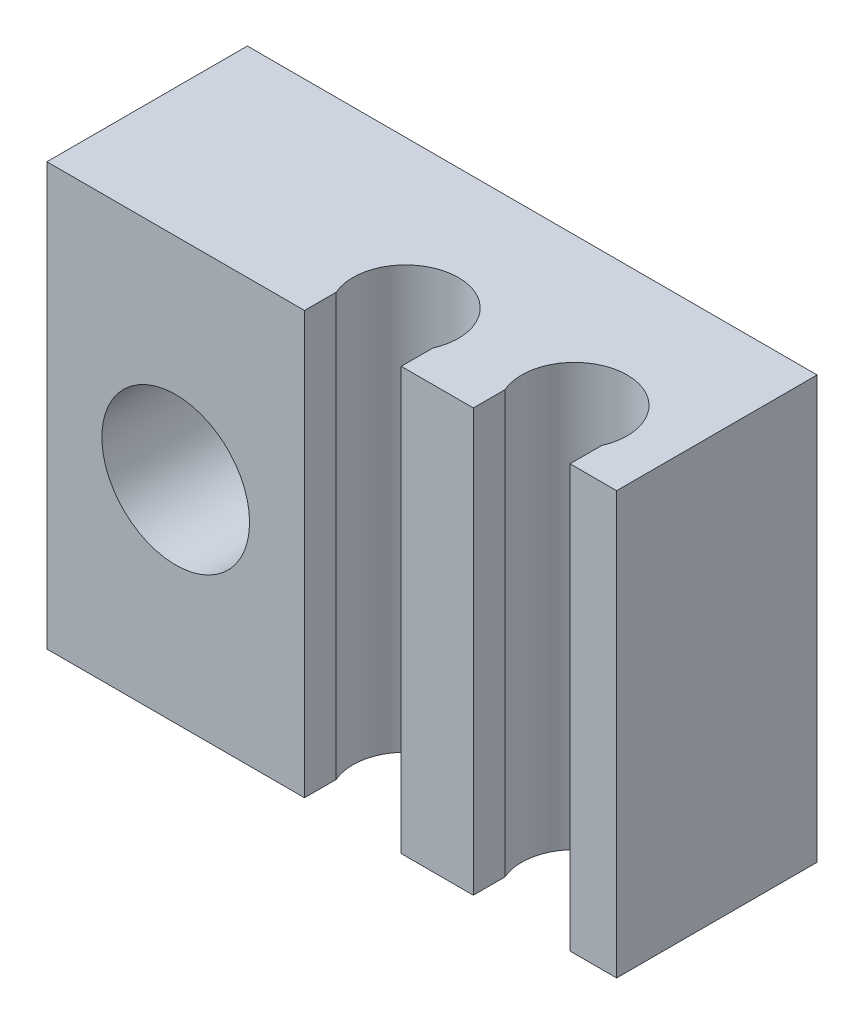
ISO-10303-21;
HEADER;
FILE_DESCRIPTION(('STEP AP214'),'2;1');
FILE_NAME('part.step','',(''),(''),'','','');
FILE_SCHEMA(('AUTOMOTIVE_DESIGN { 1 0 10303 214 1 1 1 1 }'));
ENDSEC;
DATA;
#1=APPLICATION_CONTEXT('core data for automotive mechanical design processes');
#2=APPLICATION_PROTOCOL_DEFINITION('international standard','automotive_design',2000,#1);
#3=PRODUCT_CONTEXT('',#1,'mechanical');
#4=PRODUCT('Part','Part','',(#3));
#5=PRODUCT_RELATED_PRODUCT_CATEGORY('part','',(#4));
#6=PRODUCT_DEFINITION_FORMATION('','',#4);
#7=PRODUCT_DEFINITION_CONTEXT('part definition',#1,'design');
#8=PRODUCT_DEFINITION('design','',#6,#7);
#9=PRODUCT_DEFINITION_SHAPE('','',#8);
#10=(LENGTH_UNIT() NAMED_UNIT(*) SI_UNIT(.MILLI.,.METRE.));
#11=(NAMED_UNIT(*) PLANE_ANGLE_UNIT() SI_UNIT($,.RADIAN.));
#12=(NAMED_UNIT(*) SI_UNIT($,.STERADIAN.) SOLID_ANGLE_UNIT());
#13=UNCERTAINTY_MEASURE_WITH_UNIT(LENGTH_MEASURE(1.E-05),#10,'distance_accuracy_value','');
#14=(GEOMETRIC_REPRESENTATION_CONTEXT(3) GLOBAL_UNCERTAINTY_ASSIGNED_CONTEXT((#13)) GLOBAL_UNIT_ASSIGNED_CONTEXT((#10,
#11,#12)) REPRESENTATION_CONTEXT('',''));
#15=CARTESIAN_POINT('',(0.,0.,0.));
#16=DIRECTION('',(0.,0.,1.));
#17=DIRECTION('',(1.,0.,0.));
#18=AXIS2_PLACEMENT_3D('',#15,#16,#17);
#19=CARTESIAN_POINT('',(1.10435607626104,10.,0.));
#20=DIRECTION('',(1.,0.,0.));
#21=DIRECTION('',(0.,0.,-1.));
#22=AXIS2_PLACEMENT_3D('',#19,#20,#21);
#23=PLANE('',#22);
#24=DIRECTION('',(0.,0.,1.));
#25=VECTOR('',#24,1.);
#26=CARTESIAN_POINT('',(1.10435607626104,0.,0.));
#27=LINE('',#26,#25);
#28=CARTESIAN_POINT('',(1.10435607626104,0.,0.));
#29=VERTEX_POINT('',#28);
#30=CARTESIAN_POINT('',(1.10435607626104,0.,0.750000000000001));
#31=VERTEX_POINT('',#30);
#32=EDGE_CURVE('E157',#29,#31,#27,.T.);
#33=ORIENTED_EDGE('',*,*,#32,.F.);
#34=DIRECTION('',(0.,-1.,0.));
#35=VECTOR('',#34,1.);
#36=CARTESIAN_POINT('',(1.10435607626104,10.,0.));
#37=LINE('',#36,#35);
#38=CARTESIAN_POINT('',(1.10435607626104,10.,0.));
#39=VERTEX_POINT('',#38);
#40=EDGE_CURVE('E11',#39,#29,#37,.T.);
#41=ORIENTED_EDGE('',*,*,#40,.F.);
#42=DIRECTION('',(0.,0.,1.));
#43=VECTOR('',#42,1.);
#44=CARTESIAN_POINT('',(1.10435607626104,10.,0.));
#45=LINE('',#44,#43);
#46=CARTESIAN_POINT('',(1.10435607626104,10.,0.750000000000001));
#47=VERTEX_POINT('',#46);
#48=EDGE_CURVE('E185',#39,#47,#45,.T.);
#49=ORIENTED_EDGE('',*,*,#48,.T.);
#50=DIRECTION('',(0.,-1.,0.));
#51=VECTOR('',#50,1.);
#52=CARTESIAN_POINT('',(1.10435607626104,10.,0.750000000000001));
#53=LINE('',#52,#51);
#54=EDGE_CURVE('E104',#47,#31,#53,.T.);
#55=ORIENTED_EDGE('',*,*,#54,.T.);
#56=EDGE_LOOP('',(#33,#41,#49,#55));
#57=FACE_BOUND('',#56,.T.);
#58=ADVANCED_FACE('F41',(#57),#23,.T.);
#59=CARTESIAN_POINT('',(2.25,10.,-0.5));
#60=DIRECTION('',(0.,-1.,0.));
#61=DIRECTION('',(0.,0.,-1.));
#62=AXIS2_PLACEMENT_3D('',#59,#60,#61);
#63=CYLINDRICAL_SURFACE('',#62,1.25);
#64=CARTESIAN_POINT('',(2.25,0.,-0.5));
#65=DIRECTION('',(0.,1.,0.));
#66=DIRECTION('',(0.,0.,1.));
#67=AXIS2_PLACEMENT_3D('',#64,#65,#66);
#68=CIRCLE('',#67,1.25);
#69=CARTESIAN_POINT('',(3.39564392373896,0.,0.));
#70=VERTEX_POINT('',#69);
#71=EDGE_CURVE('E160',#70,#29,#68,.T.);
#72=ORIENTED_EDGE('',*,*,#71,.F.);
#73=DIRECTION('',(0.,-1.,0.));
#74=VECTOR('',#73,1.);
#75=CARTESIAN_POINT('',(3.39564392373896,10.,0.));
#76=LINE('',#75,#74);
#77=CARTESIAN_POINT('',(3.39564392373896,10.,0.));
#78=VERTEX_POINT('',#77);
#79=EDGE_CURVE('E49',#78,#70,#76,.T.);
#80=ORIENTED_EDGE('',*,*,#79,.F.);
#81=CARTESIAN_POINT('',(2.25,10.,-0.5));
#82=DIRECTION('',(0.,1.,0.));
#83=DIRECTION('',(0.,0.,1.));
#84=AXIS2_PLACEMENT_3D('',#81,#82,#83);
#85=CIRCLE('',#84,1.25);
#86=EDGE_CURVE('E217',#78,#39,#85,.T.);
#87=ORIENTED_EDGE('',*,*,#86,.T.);
#88=ORIENTED_EDGE('',*,*,#40,.T.);
#89=EDGE_LOOP('',(#72,#80,#87,#88));
#90=FACE_BOUND('',#89,.T.);
#91=ADVANCED_FACE('F216',(#90),#63,.F.);
#92=CARTESIAN_POINT('',(3.39564392373896,10.,0.));
#93=DIRECTION('',(1.,0.,0.));
#94=DIRECTION('',(0.,0.,-1.));
#95=AXIS2_PLACEMENT_3D('',#92,#93,#94);
#96=PLANE('',#95);
#97=DIRECTION('',(0.,0.,1.));
#98=VECTOR('',#97,1.);
#99=CARTESIAN_POINT('',(3.39564392373896,0.,0.));
#100=LINE('',#99,#98);
#101=CARTESIAN_POINT('',(3.39564392373896,0.,0.750000000000001));
#102=VERTEX_POINT('',#101);
#103=EDGE_CURVE('E164',#70,#102,#100,.T.);
#104=ORIENTED_EDGE('',*,*,#103,.T.);
#105=DIRECTION('',(0.,-1.,0.));
#106=VECTOR('',#105,1.);
#107=CARTESIAN_POINT('',(3.39564392373896,10.,0.750000000000001));
#108=LINE('',#107,#106);
#109=CARTESIAN_POINT('',(3.39564392373896,10.,0.750000000000001));
#110=VERTEX_POINT('',#109);
#111=EDGE_CURVE('E201',#110,#102,#108,.T.);
#112=ORIENTED_EDGE('',*,*,#111,.F.);
#113=DIRECTION('',(0.,0.,1.));
#114=VECTOR('',#113,1.);
#115=CARTESIAN_POINT('',(3.39564392373896,10.,0.));
#116=LINE('',#115,#114);
#117=EDGE_CURVE('E208',#78,#110,#116,.T.);
#118=ORIENTED_EDGE('',*,*,#117,.F.);
#119=ORIENTED_EDGE('',*,*,#79,.T.);
#120=EDGE_LOOP('',(#104,#112,#118,#119));
#121=FACE_BOUND('',#120,.T.);
#122=ADVANCED_FACE('F206',(#121),#96,.F.);
#123=CARTESIAN_POINT('',(0.,10.,0.750000000000001));
#124=DIRECTION('',(0.,0.,-1.));
#125=DIRECTION('',(-1.,0.,0.));
#126=AXIS2_PLACEMENT_3D('',#123,#124,#125);
#127=PLANE('',#126);
#128=DIRECTION('',(1.,0.,0.));
#129=VECTOR('',#128,1.);
#130=CARTESIAN_POINT('',(0.,0.,0.750000000000001));
#131=LINE('',#130,#129);
#132=CARTESIAN_POINT('',(5.10435607626104,0.,0.750000000000001));
#133=VERTEX_POINT('',#132);
#134=EDGE_CURVE('E166',#102,#133,#131,.T.);
#135=ORIENTED_EDGE('',*,*,#134,.T.);
#136=DIRECTION('',(0.,-1.,0.));
#137=VECTOR('',#136,1.);
#138=CARTESIAN_POINT('',(5.10435607626104,10.,0.750000000000001));
#139=LINE('',#138,#137);
#140=CARTESIAN_POINT('',(5.10435607626104,10.,0.750000000000001));
#141=VERTEX_POINT('',#140);
#142=EDGE_CURVE('E199',#141,#133,#139,.T.);
#143=ORIENTED_EDGE('',*,*,#142,.F.);
#144=DIRECTION('',(1.,0.,0.));
#145=VECTOR('',#144,1.);
#146=CARTESIAN_POINT('',(0.,10.,0.750000000000001));
#147=LINE('',#146,#145);
#148=EDGE_CURVE('E228',#110,#141,#147,.T.);
#149=ORIENTED_EDGE('',*,*,#148,.F.);
#150=ORIENTED_EDGE('',*,*,#111,.T.);
#151=EDGE_LOOP('',(#135,#143,#149,#150));
#152=FACE_BOUND('',#151,.T.);
#153=ADVANCED_FACE('F262',(#152),#127,.F.);
#154=CARTESIAN_POINT('',(5.10435607626104,10.,0.));
#155=DIRECTION('',(1.,0.,0.));
#156=DIRECTION('',(0.,0.,-1.));
#157=AXIS2_PLACEMENT_3D('',#154,#155,#156);
#158=PLANE('',#157);
#159=DIRECTION('',(0.,0.,1.));
#160=VECTOR('',#159,1.);
#161=CARTESIAN_POINT('',(5.10435607626104,0.,0.));
#162=LINE('',#161,#160);
#163=CARTESIAN_POINT('',(5.10435607626104,0.,0.));
#164=VERTEX_POINT('',#163);
#165=EDGE_CURVE('E169',#164,#133,#162,.T.);
#166=ORIENTED_EDGE('',*,*,#165,.F.);
#167=DIRECTION('',(0.,-1.,0.));
#168=VECTOR('',#167,1.);
#169=CARTESIAN_POINT('',(5.10435607626104,10.,0.));
#170=LINE('',#169,#168);
#171=CARTESIAN_POINT('',(5.10435607626104,10.,0.));
#172=VERTEX_POINT('',#171);
#173=EDGE_CURVE('E197',#172,#164,#170,.T.);
#174=ORIENTED_EDGE('',*,*,#173,.F.);
#175=DIRECTION('',(0.,0.,1.));
#176=VECTOR('',#175,1.);
#177=CARTESIAN_POINT('',(5.10435607626104,10.,0.));
#178=LINE('',#177,#176);
#179=EDGE_CURVE('E230',#172,#141,#178,.T.);
#180=ORIENTED_EDGE('',*,*,#179,.T.);
#181=ORIENTED_EDGE('',*,*,#142,.T.);
#182=EDGE_LOOP('',(#166,#174,#180,#181));
#183=FACE_BOUND('',#182,.T.);
#184=ADVANCED_FACE('F258',(#183),#158,.T.);
#185=CARTESIAN_POINT('',(6.25,10.,-0.5));
#186=DIRECTION('',(0.,-1.,0.));
#187=DIRECTION('',(0.,0.,-1.));
#188=AXIS2_PLACEMENT_3D('',#185,#186,#187);
#189=CYLINDRICAL_SURFACE('',#188,1.25);
#190=CARTESIAN_POINT('',(6.25,0.,-0.5));
#191=DIRECTION('',(0.,1.,0.));
#192=DIRECTION('',(0.,0.,1.));
#193=AXIS2_PLACEMENT_3D('',#190,#191,#192);
#194=CIRCLE('',#193,1.25);
#195=CARTESIAN_POINT('',(7.39564392373896,0.,0.));
#196=VERTEX_POINT('',#195);
#197=EDGE_CURVE('E172',#196,#164,#194,.T.);
#198=ORIENTED_EDGE('',*,*,#197,.F.);
#199=DIRECTION('',(0.,-1.,0.));
#200=VECTOR('',#199,1.);
#201=CARTESIAN_POINT('',(7.39564392373896,10.,0.));
#202=LINE('',#201,#200);
#203=CARTESIAN_POINT('',(7.39564392373896,10.,0.));
#204=VERTEX_POINT('',#203);
#205=EDGE_CURVE('E195',#204,#196,#202,.T.);
#206=ORIENTED_EDGE('',*,*,#205,.F.);
#207=CARTESIAN_POINT('',(6.25,10.,-0.5));
#208=DIRECTION('',(0.,1.,0.));
#209=DIRECTION('',(0.,0.,1.));
#210=AXIS2_PLACEMENT_3D('',#207,#208,#209);
#211=CIRCLE('',#210,1.25);
#212=EDGE_CURVE('E233',#204,#172,#211,.T.);
#213=ORIENTED_EDGE('',*,*,#212,.T.);
#214=ORIENTED_EDGE('',*,*,#173,.T.);
#215=EDGE_LOOP('',(#198,#206,#213,#214));
#216=FACE_BOUND('',#215,.T.);
#217=ADVANCED_FACE('F254',(#216),#189,.F.);
#218=CARTESIAN_POINT('',(7.39564392373896,10.,0.));
#219=DIRECTION('',(1.,0.,0.));
#220=DIRECTION('',(0.,0.,-1.));
#221=AXIS2_PLACEMENT_3D('',#218,#219,#220);
#222=PLANE('',#221);
#223=DIRECTION('',(0.,0.,1.));
#224=VECTOR('',#223,1.);
#225=CARTESIAN_POINT('',(7.39564392373896,0.,0.));
#226=LINE('',#225,#224);
#227=CARTESIAN_POINT('',(7.39564392373896,0.,0.750000000000001));
#228=VERTEX_POINT('',#227);
#229=EDGE_CURVE('E175',#196,#228,#226,.T.);
#230=ORIENTED_EDGE('',*,*,#229,.T.);
#231=DIRECTION('',(0.,-1.,0.));
#232=VECTOR('',#231,1.);
#233=CARTESIAN_POINT('',(7.39564392373896,10.,0.750000000000001));
#234=LINE('',#233,#232);
#235=CARTESIAN_POINT('',(7.39564392373896,10.,0.750000000000001));
#236=VERTEX_POINT('',#235);
#237=EDGE_CURVE('E192',#236,#228,#234,.T.);
#238=ORIENTED_EDGE('',*,*,#237,.F.);
#239=DIRECTION('',(0.,0.,1.));
#240=VECTOR('',#239,1.);
#241=CARTESIAN_POINT('',(7.39564392373896,10.,0.));
#242=LINE('',#241,#240);
#243=EDGE_CURVE('E236',#204,#236,#242,.T.);
#244=ORIENTED_EDGE('',*,*,#243,.F.);
#245=ORIENTED_EDGE('',*,*,#205,.T.);
#246=EDGE_LOOP('',(#230,#238,#244,#245));
#247=FACE_BOUND('',#246,.T.);
#248=ADVANCED_FACE('F302',(#247),#222,.F.);
#249=CARTESIAN_POINT('',(0.,10.,0.750000000000001));
#250=DIRECTION('',(0.,0.,-1.));
#251=DIRECTION('',(-1.,0.,0.));
#252=AXIS2_PLACEMENT_3D('',#249,#250,#251);
#253=PLANE('',#252);
#254=DIRECTION('',(1.,0.,0.));
#255=VECTOR('',#254,1.);
#256=CARTESIAN_POINT('',(0.,0.,0.750000000000001));
#257=LINE('',#256,#255);
#258=CARTESIAN_POINT('',(8.5,0.,0.750000000000001));
#259=VERTEX_POINT('',#258);
#260=EDGE_CURVE('E177',#228,#259,#257,.T.);
#261=ORIENTED_EDGE('',*,*,#260,.T.);
#262=DIRECTION('',(0.,-1.,0.));
#263=VECTOR('',#262,1.);
#264=CARTESIAN_POINT('',(8.5,10.,0.750000000000001));
#265=LINE('',#264,#263);
#266=CARTESIAN_POINT('',(8.5,10.,0.750000000000001));
#267=VERTEX_POINT('',#266);
#268=EDGE_CURVE('E189',#267,#259,#265,.T.);
#269=ORIENTED_EDGE('',*,*,#268,.F.);
#270=DIRECTION('',(1.,0.,0.));
#271=VECTOR('',#270,1.);
#272=CARTESIAN_POINT('',(0.,10.,0.750000000000001));
#273=LINE('',#272,#271);
#274=EDGE_CURVE('E238',#236,#267,#273,.T.);
#275=ORIENTED_EDGE('',*,*,#274,.F.);
#276=ORIENTED_EDGE('',*,*,#237,.T.);
#277=EDGE_LOOP('',(#261,#269,#275,#276));
#278=FACE_BOUND('',#277,.T.);
#279=ADVANCED_FACE('F245',(#278),#253,.F.);
#280=CARTESIAN_POINT('',(8.5,10.,0.));
#281=DIRECTION('',(-1.,0.,0.));
#282=DIRECTION('',(0.,0.,1.));
#283=AXIS2_PLACEMENT_3D('',#280,#281,#282);
#284=PLANE('',#283);
#285=DIRECTION('',(0.,0.,-1.));
#286=VECTOR('',#285,1.);
#287=CARTESIAN_POINT('',(8.5,0.,0.));
#288=LINE('',#287,#286);
#289=CARTESIAN_POINT('',(8.5,0.,-4.));
#290=VERTEX_POINT('',#289);
#291=EDGE_CURVE('E179',#259,#290,#288,.T.);
#292=ORIENTED_EDGE('',*,*,#291,.T.);
#293=DIRECTION('',(0.,-1.,0.));
#294=VECTOR('',#293,1.);
#295=CARTESIAN_POINT('',(8.5,10.,-4.));
#296=LINE('',#295,#294);
#297=CARTESIAN_POINT('',(8.5,10.,-4.));
#298=VERTEX_POINT('',#297);
#299=EDGE_CURVE('E149',#298,#290,#296,.T.);
#300=ORIENTED_EDGE('',*,*,#299,.F.);
#301=DIRECTION('',(0.,0.,-1.));
#302=VECTOR('',#301,1.);
#303=CARTESIAN_POINT('',(8.5,10.,0.));
#304=LINE('',#303,#302);
#305=EDGE_CURVE('E140',#267,#298,#304,.T.);
#306=ORIENTED_EDGE('',*,*,#305,.F.);
#307=ORIENTED_EDGE('',*,*,#268,.T.);
#308=EDGE_LOOP('',(#292,#300,#306,#307));
#309=FACE_BOUND('',#308,.T.);
#310=ADVANCED_FACE('F249',(#309),#284,.F.);
#311=CARTESIAN_POINT('',(0.,10.,-4.));
#312=DIRECTION('',(0.,0.,1.));
#313=DIRECTION('',(1.,0.,0.));
#314=AXIS2_PLACEMENT_3D('',#311,#312,#313);
#315=PLANE('',#314);
#316=CARTESIAN_POINT('',(-1.94782196186948,5.,-4.));
#317=DIRECTION('',(0.,0.,1.));
#318=DIRECTION('',(1.,0.,0.));
#319=AXIS2_PLACEMENT_3D('',#316,#317,#318);
#320=CIRCLE('',#319,1.75);
#321=CARTESIAN_POINT('',(-0.197821961869481,5.,-4.));
#322=VERTEX_POINT('',#321);
#323=EDGE_CURVE('E161',#322,#322,#320,.T.);
#324=ORIENTED_EDGE('',*,*,#323,.T.);
#325=EDGE_LOOP('',(#324));
#326=FACE_BOUND('',#325,.T.);
#327=DIRECTION('',(-1.,0.,0.));
#328=VECTOR('',#327,1.);
#329=CARTESIAN_POINT('',(0.,0.,-4.));
#330=LINE('',#329,#328);
#331=CARTESIAN_POINT('',(-5.,0.,-4.));
#332=VERTEX_POINT('',#331);
#333=EDGE_CURVE('E148',#290,#332,#330,.T.);
#334=ORIENTED_EDGE('',*,*,#333,.T.);
#335=DIRECTION('',(0.,-1.,0.));
#336=VECTOR('',#335,1.);
#337=CARTESIAN_POINT('',(-5.,10.,-4.));
#338=LINE('',#337,#336);
#339=CARTESIAN_POINT('',(-5.,10.,-4.));
#340=VERTEX_POINT('',#339);
#341=EDGE_CURVE('E145',#340,#332,#338,.T.);
#342=ORIENTED_EDGE('',*,*,#341,.F.);
#343=DIRECTION('',(-1.,0.,0.));
#344=VECTOR('',#343,1.);
#345=CARTESIAN_POINT('',(0.,10.,-4.));
#346=LINE('',#345,#344);
#347=EDGE_CURVE('E134',#298,#340,#346,.T.);
#348=ORIENTED_EDGE('',*,*,#347,.F.);
#349=ORIENTED_EDGE('',*,*,#299,.T.);
#350=EDGE_LOOP('',(#334,#342,#348,#349));
#351=FACE_BOUND('',#350,.T.);
#352=ADVANCED_FACE('F146',(#326,#351),#315,.F.);
#353=CARTESIAN_POINT('',(-5.,10.,0.));
#354=DIRECTION('',(1.,0.,0.));
#355=DIRECTION('',(0.,0.,-1.));
#356=AXIS2_PLACEMENT_3D('',#353,#354,#355);
#357=PLANE('',#356);
#358=DIRECTION('',(0.,0.,1.));
#359=VECTOR('',#358,1.);
#360=CARTESIAN_POINT('',(-5.,0.,0.));
#361=LINE('',#360,#359);
#362=CARTESIAN_POINT('',(-5.,0.,0.750000000000001));
#363=VERTEX_POINT('',#362);
#364=EDGE_CURVE('E97',#332,#363,#361,.T.);
#365=ORIENTED_EDGE('',*,*,#364,.T.);
#366=DIRECTION('',(0.,-1.,0.));
#367=VECTOR('',#366,1.);
#368=CARTESIAN_POINT('',(-5.,10.,0.750000000000001));
#369=LINE('',#368,#367);
#370=CARTESIAN_POINT('',(-5.,10.,0.750000000000001));
#371=VERTEX_POINT('',#370);
#372=EDGE_CURVE('E150',#371,#363,#369,.T.);
#373=ORIENTED_EDGE('',*,*,#372,.F.);
#374=DIRECTION('',(0.,0.,1.));
#375=VECTOR('',#374,1.);
#376=CARTESIAN_POINT('',(-5.,10.,0.));
#377=LINE('',#376,#375);
#378=EDGE_CURVE('E138',#340,#371,#377,.T.);
#379=ORIENTED_EDGE('',*,*,#378,.F.);
#380=ORIENTED_EDGE('',*,*,#341,.T.);
#381=EDGE_LOOP('',(#365,#373,#379,#380));
#382=FACE_BOUND('',#381,.T.);
#383=ADVANCED_FACE('F152',(#382),#357,.F.);
#384=CARTESIAN_POINT('',(0.,10.,0.750000000000001));
#385=DIRECTION('',(0.,0.,-1.));
#386=DIRECTION('',(-1.,0.,0.));
#387=AXIS2_PLACEMENT_3D('',#384,#385,#386);
#388=PLANE('',#387);
#389=CARTESIAN_POINT('',(-1.94782196186948,5.,0.750000000000001));
#390=DIRECTION('',(0.,0.,1.));
#391=DIRECTION('',(1.,0.,0.));
#392=AXIS2_PLACEMENT_3D('',#389,#390,#391);
#393=CIRCLE('',#392,1.75);
#394=CARTESIAN_POINT('',(-0.197821961869481,5.,0.750000000000001));
#395=VERTEX_POINT('',#394);
#396=EDGE_CURVE('E224',#395,#395,#393,.T.);
#397=ORIENTED_EDGE('',*,*,#396,.F.);
#398=EDGE_LOOP('',(#397));
#399=FACE_BOUND('',#398,.T.);
#400=DIRECTION('',(1.,0.,0.));
#401=VECTOR('',#400,1.);
#402=CARTESIAN_POINT('',(0.,0.,0.750000000000001));
#403=LINE('',#402,#401);
#404=EDGE_CURVE('E183',#363,#31,#403,.T.);
#405=ORIENTED_EDGE('',*,*,#404,.T.);
#406=ORIENTED_EDGE('',*,*,#54,.F.);
#407=DIRECTION('',(1.,0.,0.));
#408=VECTOR('',#407,1.);
#409=CARTESIAN_POINT('',(0.,10.,0.750000000000001));
#410=LINE('',#409,#408);
#411=EDGE_CURVE('E57',#371,#47,#410,.T.);
#412=ORIENTED_EDGE('',*,*,#411,.F.);
#413=ORIENTED_EDGE('',*,*,#372,.T.);
#414=EDGE_LOOP('',(#405,#406,#412,#413));
#415=FACE_BOUND('',#414,.T.);
#416=ADVANCED_FACE('F220',(#399,#415),#388,.F.);
#417=CARTESIAN_POINT('',(0.,10.,0.));
#418=DIRECTION('',(0.,1.,0.));
#419=DIRECTION('',(0.,0.,1.));
#420=AXIS2_PLACEMENT_3D('',#417,#418,#419);
#421=PLANE('',#420);
#422=ORIENTED_EDGE('',*,*,#48,.F.);
#423=ORIENTED_EDGE('',*,*,#86,.F.);
#424=ORIENTED_EDGE('',*,*,#117,.T.);
#425=ORIENTED_EDGE('',*,*,#148,.T.);
#426=ORIENTED_EDGE('',*,*,#179,.F.);
#427=ORIENTED_EDGE('',*,*,#212,.F.);
#428=ORIENTED_EDGE('',*,*,#243,.T.);
#429=ORIENTED_EDGE('',*,*,#274,.T.);
#430=ORIENTED_EDGE('',*,*,#305,.T.);
#431=ORIENTED_EDGE('',*,*,#347,.T.);
#432=ORIENTED_EDGE('',*,*,#378,.T.);
#433=ORIENTED_EDGE('',*,*,#411,.T.);
#434=EDGE_LOOP('',(#422,#423,#424,#425,#426,#427,#428,#429,#430,#431,#432,#433));
#435=FACE_BOUND('',#434,.T.);
#436=ADVANCED_FACE('F136',(#435),#421,.T.);
#437=CARTESIAN_POINT('',(0.,0.,0.));
#438=DIRECTION('',(0.,1.,0.));
#439=DIRECTION('',(0.,0.,1.));
#440=AXIS2_PLACEMENT_3D('',#437,#438,#439);
#441=PLANE('',#440);
#442=ORIENTED_EDGE('',*,*,#32,.T.);
#443=ORIENTED_EDGE('',*,*,#404,.F.);
#444=ORIENTED_EDGE('',*,*,#364,.F.);
#445=ORIENTED_EDGE('',*,*,#333,.F.);
#446=ORIENTED_EDGE('',*,*,#291,.F.);
#447=ORIENTED_EDGE('',*,*,#260,.F.);
#448=ORIENTED_EDGE('',*,*,#229,.F.);
#449=ORIENTED_EDGE('',*,*,#197,.T.);
#450=ORIENTED_EDGE('',*,*,#165,.T.);
#451=ORIENTED_EDGE('',*,*,#134,.F.);
#452=ORIENTED_EDGE('',*,*,#103,.F.);
#453=ORIENTED_EDGE('',*,*,#71,.T.);
#454=EDGE_LOOP('',(#442,#443,#444,#445,#446,#447,#448,#449,#450,#451,#452,#453));
#455=FACE_BOUND('',#454,.T.);
#456=ADVANCED_FACE('F215',(#455),#441,.F.);
#457=CARTESIAN_POINT('',(-1.94782196186948,5.,-4.));
#458=DIRECTION('',(0.,0.,1.));
#459=DIRECTION('',(1.,0.,0.));
#460=AXIS2_PLACEMENT_3D('',#457,#458,#459);
#461=CYLINDRICAL_SURFACE('',#460,1.75);
#462=ORIENTED_EDGE('',*,*,#323,.F.);
#463=EDGE_LOOP('',(#462));
#464=FACE_BOUND('',#463,.T.);
#465=ORIENTED_EDGE('',*,*,#396,.T.);
#466=EDGE_LOOP('',(#465));
#467=FACE_BOUND('',#466,.T.);
#468=ADVANCED_FACE('F397',(#464,#467),#461,.F.);
#469=CLOSED_SHELL('',(#58,#91,#122,#153,#184,#217,#248,#279,#310,#352,#383,#416,#436,#456,#468));
#470=MANIFOLD_SOLID_BREP('B2',#469);
#471=ADVANCED_BREP_SHAPE_REPRESENTATION('',(#18,#470),#14);
#472=SHAPE_DEFINITION_REPRESENTATION(#9,#471);
ENDSEC;
END-ISO-10303-21;
